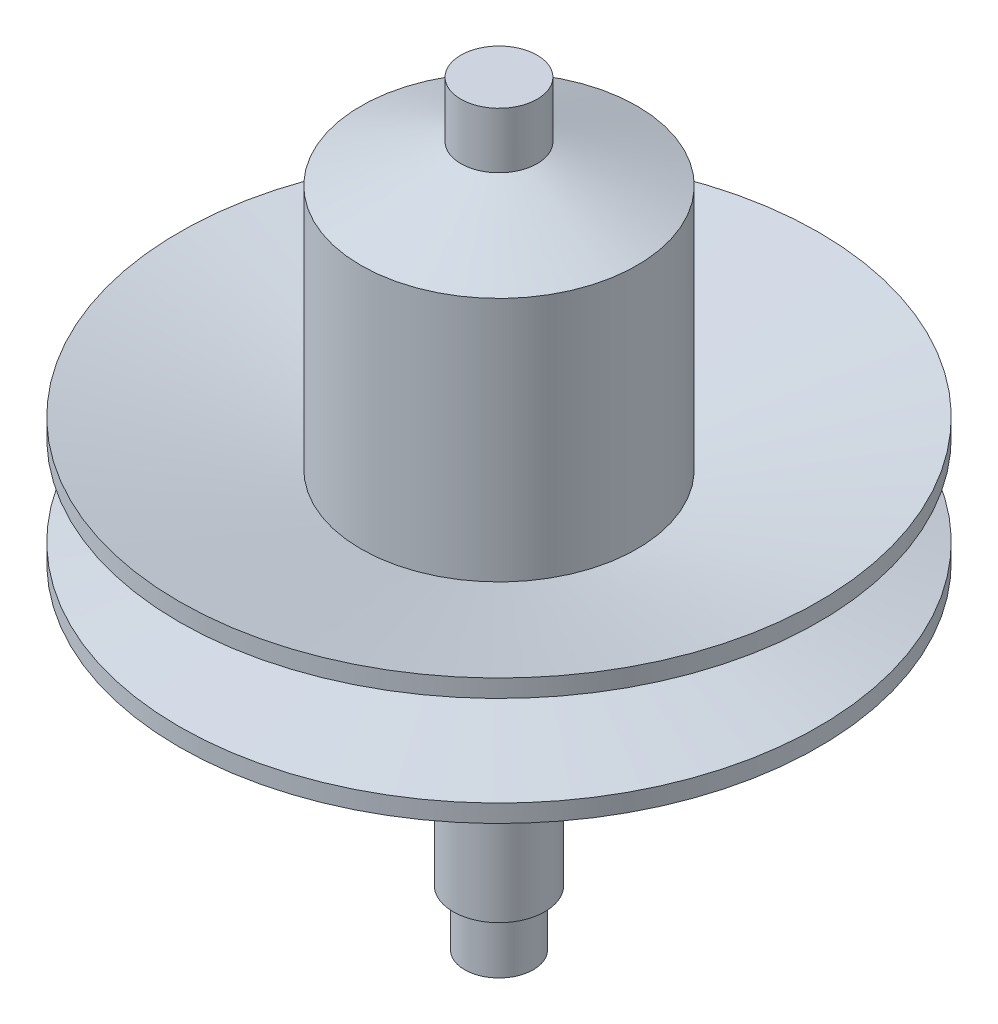
ISO-10303-21;
HEADER;
FILE_DESCRIPTION(('STEP AP214'),'2;1');
FILE_NAME('part.step','',(''),(''),'','','');
FILE_SCHEMA(('AUTOMOTIVE_DESIGN { 1 0 10303 214 1 1 1 1 }'));
ENDSEC;
DATA;
#1=APPLICATION_CONTEXT('core data for automotive mechanical design processes');
#2=APPLICATION_PROTOCOL_DEFINITION('international standard','automotive_design',2000,#1);
#3=PRODUCT_CONTEXT('',#1,'mechanical');
#4=PRODUCT('Part','Part','',(#3));
#5=PRODUCT_RELATED_PRODUCT_CATEGORY('part','',(#4));
#6=PRODUCT_DEFINITION_FORMATION('','',#4);
#7=PRODUCT_DEFINITION_CONTEXT('part definition',#1,'design');
#8=PRODUCT_DEFINITION('design','',#6,#7);
#9=PRODUCT_DEFINITION_SHAPE('','',#8);
#10=(LENGTH_UNIT() NAMED_UNIT(*) SI_UNIT(.MILLI.,.METRE.));
#11=(NAMED_UNIT(*) PLANE_ANGLE_UNIT() SI_UNIT($,.RADIAN.));
#12=(NAMED_UNIT(*) SI_UNIT($,.STERADIAN.) SOLID_ANGLE_UNIT());
#13=UNCERTAINTY_MEASURE_WITH_UNIT(LENGTH_MEASURE(1.E-05),#10,'distance_accuracy_value','');
#14=(GEOMETRIC_REPRESENTATION_CONTEXT(3) GLOBAL_UNCERTAINTY_ASSIGNED_CONTEXT((#13)) GLOBAL_UNIT_ASSIGNED_CONTEXT((#10,
#11,#12)) REPRESENTATION_CONTEXT('',''));
#15=CARTESIAN_POINT('',(0.,0.,0.));
#16=DIRECTION('',(0.,0.,1.));
#17=DIRECTION('',(1.,0.,0.));
#18=AXIS2_PLACEMENT_3D('',#15,#16,#17);
#19=CARTESIAN_POINT('',(4.5,0.,0.));
#20=DIRECTION('',(0.,1.,0.));
#21=DIRECTION('',(0.,0.,1.));
#22=AXIS2_PLACEMENT_3D('',#19,#20,#21);
#23=PLANE('',#22);
#24=CARTESIAN_POINT('',(0.,0.,0.));
#25=DIRECTION('',(0.,1.,0.));
#26=DIRECTION('',(0.,0.,1.));
#27=AXIS2_PLACEMENT_3D('',#24,#25,#26);
#28=CIRCLE('',#27,4.5);
#29=CARTESIAN_POINT('',(0.,0.,4.5));
#30=VERTEX_POINT('',#29);
#31=EDGE_CURVE('E10',#30,#30,#28,.T.);
#32=ORIENTED_EDGE('',*,*,#31,.F.);
#33=EDGE_LOOP('',(#32));
#34=FACE_BOUND('',#33,.T.);
#35=ADVANCED_FACE('F34',(#34),#23,.F.);
#36=CARTESIAN_POINT('',(0.,99.06,0.));
#37=DIRECTION('',(0.,1.,0.));
#38=DIRECTION('',(0.,0.,1.));
#39=AXIS2_PLACEMENT_3D('',#36,#37,#38);
#40=CYLINDRICAL_SURFACE('',#39,4.5);
#41=CARTESIAN_POINT('',(0.,7.33580000000002,0.));
#42=DIRECTION('',(0.,1.,0.));
#43=DIRECTION('',(0.,0.,1.));
#44=AXIS2_PLACEMENT_3D('',#41,#42,#43);
#45=CIRCLE('',#44,4.5);
#46=CARTESIAN_POINT('',(0.,7.33580000000002,4.5));
#47=VERTEX_POINT('',#46);
#48=EDGE_CURVE('E41',#47,#47,#45,.T.);
#49=ORIENTED_EDGE('',*,*,#48,.F.);
#50=EDGE_LOOP('',(#49));
#51=FACE_BOUND('',#50,.T.);
#52=ORIENTED_EDGE('',*,*,#31,.T.);
#53=EDGE_LOOP('',(#52));
#54=FACE_BOUND('',#53,.T.);
#55=ADVANCED_FACE('F168',(#51,#54),#40,.T.);
#56=CARTESIAN_POINT('',(6.00000000000003,7.33580000000002,0.));
#57=DIRECTION('',(0.,1.,0.));
#58=DIRECTION('',(0.,0.,1.));
#59=AXIS2_PLACEMENT_3D('',#56,#57,#58);
#60=PLANE('',#59);
#61=CARTESIAN_POINT('',(0.,7.33580000000002,0.));
#62=DIRECTION('',(0.,1.,0.));
#63=DIRECTION('',(0.,0.,1.));
#64=AXIS2_PLACEMENT_3D('',#61,#62,#63);
#65=CIRCLE('',#64,6.00000000000003);
#66=CARTESIAN_POINT('',(0.,7.33580000000002,6.00000000000003));
#67=VERTEX_POINT('',#66);
#68=EDGE_CURVE('E46',#67,#67,#65,.T.);
#69=ORIENTED_EDGE('',*,*,#68,.F.);
#70=EDGE_LOOP('',(#69));
#71=FACE_BOUND('',#70,.T.);
#72=ORIENTED_EDGE('',*,*,#48,.T.);
#73=EDGE_LOOP('',(#72));
#74=FACE_BOUND('',#73,.T.);
#75=ADVANCED_FACE('F163',(#71,#74),#60,.F.);
#76=CARTESIAN_POINT('',(0.,99.06,0.));
#77=DIRECTION('',(0.,1.,0.));
#78=DIRECTION('',(0.,0.,1.));
#79=AXIS2_PLACEMENT_3D('',#76,#77,#78);
#80=CYLINDRICAL_SURFACE('',#79,6.00000000000003);
#81=CARTESIAN_POINT('',(0.,49.9241417636139,0.));
#82=DIRECTION('',(0.,1.,0.));
#83=DIRECTION('',(0.,0.,1.));
#84=AXIS2_PLACEMENT_3D('',#81,#82,#83);
#85=CIRCLE('',#84,6.00000000000003);
#86=CARTESIAN_POINT('',(0.,49.9241417636139,6.00000000000003));
#87=VERTEX_POINT('',#86);
#88=EDGE_CURVE('E51',#87,#87,#85,.T.);
#89=ORIENTED_EDGE('',*,*,#88,.F.);
#90=EDGE_LOOP('',(#89));
#91=FACE_BOUND('',#90,.T.);
#92=ORIENTED_EDGE('',*,*,#68,.T.);
#93=EDGE_LOOP('',(#92));
#94=FACE_BOUND('',#93,.T.);
#95=ADVANCED_FACE('F157',(#91,#94),#80,.T.);
#96=CARTESIAN_POINT('',(6.00000000000003,49.9241417636139,0.));
#97=DIRECTION('',(0.,1.,0.));
#98=DIRECTION('',(0.,0.,1.));
#99=AXIS2_PLACEMENT_3D('',#96,#97,#98);
#100=PLANE('',#99);
#101=CARTESIAN_POINT('',(0.,49.9241417636139,0.));
#102=DIRECTION('',(0.,1.,0.));
#103=DIRECTION('',(0.,0.,1.));
#104=AXIS2_PLACEMENT_3D('',#101,#102,#103);
#105=CIRCLE('',#104,18.0975);
#106=CARTESIAN_POINT('',(0.,49.9241417636139,18.0975));
#107=VERTEX_POINT('',#106);
#108=EDGE_CURVE('E57',#107,#107,#105,.T.);
#109=ORIENTED_EDGE('',*,*,#108,.F.);
#110=EDGE_LOOP('',(#109));
#111=FACE_BOUND('',#110,.T.);
#112=ORIENTED_EDGE('',*,*,#88,.T.);
#113=EDGE_LOOP('',(#112));
#114=FACE_BOUND('',#113,.T.);
#115=ADVANCED_FACE('F151',(#111,#114),#100,.F.);
#116=CARTESIAN_POINT('',(0.,49.9241417636139,0.));
#117=DIRECTION('',(0.,-1.,0.));
#118=DIRECTION('',(0.,0.,-1.));
#119=AXIS2_PLACEMENT_3D('',#116,#117,#118);
#120=CONICAL_SURFACE('',#119,18.0975,1.32648902966889);
#121=CARTESIAN_POINT('',(0.,43.988,0.));
#122=DIRECTION('',(0.,1.,0.));
#123=DIRECTION('',(0.,0.,1.));
#124=AXIS2_PLACEMENT_3D('',#121,#122,#123);
#125=CIRCLE('',#124,41.91);
#126=CARTESIAN_POINT('',(0.,43.988,41.91));
#127=VERTEX_POINT('',#126);
#128=EDGE_CURVE('E61',#127,#127,#125,.T.);
#129=ORIENTED_EDGE('',*,*,#128,.F.);
#130=EDGE_LOOP('',(#129));
#131=FACE_BOUND('',#130,.T.);
#132=ORIENTED_EDGE('',*,*,#108,.T.);
#133=EDGE_LOOP('',(#132));
#134=FACE_BOUND('',#133,.T.);
#135=ADVANCED_FACE('F145',(#131,#134),#120,.F.);
#136=CARTESIAN_POINT('',(0.,99.06,0.));
#137=DIRECTION('',(0.,1.,0.));
#138=DIRECTION('',(0.,0.,1.));
#139=AXIS2_PLACEMENT_3D('',#136,#137,#138);
#140=CYLINDRICAL_SURFACE('',#139,41.91);
#141=CARTESIAN_POINT('',(0.,46.3068582363862,0.));
#142=DIRECTION('',(0.,1.,0.));
#143=DIRECTION('',(0.,0.,1.));
#144=AXIS2_PLACEMENT_3D('',#141,#142,#143);
#145=CIRCLE('',#144,41.91);
#146=CARTESIAN_POINT('',(0.,46.3068582363862,41.91));
#147=VERTEX_POINT('',#146);
#148=EDGE_CURVE('E65',#147,#147,#145,.T.);
#149=ORIENTED_EDGE('',*,*,#148,.F.);
#150=EDGE_LOOP('',(#149));
#151=FACE_BOUND('',#150,.T.);
#152=ORIENTED_EDGE('',*,*,#128,.T.);
#153=EDGE_LOOP('',(#152));
#154=FACE_BOUND('',#153,.T.);
#155=ADVANCED_FACE('F139',(#151,#154),#140,.T.);
#156=CARTESIAN_POINT('',(0.,46.3068582363862,0.));
#157=DIRECTION('',(0.,-1.,0.));
#158=DIRECTION('',(0.,0.,-1.));
#159=AXIS2_PLACEMENT_3D('',#156,#157,#158);
#160=CONICAL_SURFACE('',#159,41.91,1.32648902966889);
#161=CARTESIAN_POINT('',(0.,52.243,0.));
#162=DIRECTION('',(0.,1.,0.));
#163=DIRECTION('',(0.,0.,1.));
#164=AXIS2_PLACEMENT_3D('',#161,#162,#163);
#165=CIRCLE('',#164,18.0975);
#166=CARTESIAN_POINT('',(0.,52.243,18.0975));
#167=VERTEX_POINT('',#166);
#168=EDGE_CURVE('E69',#167,#167,#165,.T.);
#169=ORIENTED_EDGE('',*,*,#168,.F.);
#170=EDGE_LOOP('',(#169));
#171=FACE_BOUND('',#170,.T.);
#172=ORIENTED_EDGE('',*,*,#148,.T.);
#173=EDGE_LOOP('',(#172));
#174=FACE_BOUND('',#173,.T.);
#175=ADVANCED_FACE('F133',(#171,#174),#160,.T.);
#176=CARTESIAN_POINT('',(0.,52.243,0.));
#177=DIRECTION('',(0.,1.,0.));
#178=DIRECTION('',(0.,0.,1.));
#179=AXIS2_PLACEMENT_3D('',#176,#177,#178);
#180=CONICAL_SURFACE('',#179,18.0975,1.32648902966889);
#181=CARTESIAN_POINT('',(0.,58.1791417636139,0.));
#182=DIRECTION('',(0.,1.,0.));
#183=DIRECTION('',(0.,0.,1.));
#184=AXIS2_PLACEMENT_3D('',#181,#182,#183);
#185=CIRCLE('',#184,41.91);
#186=CARTESIAN_POINT('',(0.,58.1791417636139,41.91));
#187=VERTEX_POINT('',#186);
#188=EDGE_CURVE('E73',#187,#187,#185,.T.);
#189=ORIENTED_EDGE('',*,*,#188,.F.);
#190=EDGE_LOOP('',(#189));
#191=FACE_BOUND('',#190,.T.);
#192=ORIENTED_EDGE('',*,*,#168,.T.);
#193=EDGE_LOOP('',(#192));
#194=FACE_BOUND('',#193,.T.);
#195=ADVANCED_FACE('F127',(#191,#194),#180,.T.);
#196=CARTESIAN_POINT('',(0.,99.06,0.));
#197=DIRECTION('',(0.,1.,0.));
#198=DIRECTION('',(0.,0.,1.));
#199=AXIS2_PLACEMENT_3D('',#196,#197,#198);
#200=CYLINDRICAL_SURFACE('',#199,41.91);
#201=CARTESIAN_POINT('',(0.,60.498,0.));
#202=DIRECTION('',(0.,1.,0.));
#203=DIRECTION('',(0.,0.,1.));
#204=AXIS2_PLACEMENT_3D('',#201,#202,#203);
#205=CIRCLE('',#204,41.91);
#206=CARTESIAN_POINT('',(0.,60.498,41.91));
#207=VERTEX_POINT('',#206);
#208=EDGE_CURVE('E77',#207,#207,#205,.T.);
#209=ORIENTED_EDGE('',*,*,#208,.F.);
#210=EDGE_LOOP('',(#209));
#211=FACE_BOUND('',#210,.T.);
#212=ORIENTED_EDGE('',*,*,#188,.T.);
#213=EDGE_LOOP('',(#212));
#214=FACE_BOUND('',#213,.T.);
#215=ADVANCED_FACE('F121',(#211,#214),#200,.T.);
#216=CARTESIAN_POINT('',(0.,60.498,0.));
#217=DIRECTION('',(0.,1.,0.));
#218=DIRECTION('',(0.,0.,1.));
#219=AXIS2_PLACEMENT_3D('',#216,#217,#218);
#220=CONICAL_SURFACE('',#219,41.91,1.32648902966889);
#221=CARTESIAN_POINT('',(0.,54.5618582363862,0.));
#222=DIRECTION('',(0.,1.,0.));
#223=DIRECTION('',(0.,0.,1.));
#224=AXIS2_PLACEMENT_3D('',#221,#222,#223);
#225=CIRCLE('',#224,18.0975);
#226=CARTESIAN_POINT('',(0.,54.5618582363862,18.0975));
#227=VERTEX_POINT('',#226);
#228=EDGE_CURVE('E81',#227,#227,#225,.T.);
#229=ORIENTED_EDGE('',*,*,#228,.F.);
#230=EDGE_LOOP('',(#229));
#231=FACE_BOUND('',#230,.T.);
#232=ORIENTED_EDGE('',*,*,#208,.T.);
#233=EDGE_LOOP('',(#232));
#234=FACE_BOUND('',#233,.T.);
#235=ADVANCED_FACE('F115',(#231,#234),#220,.F.);
#236=CARTESIAN_POINT('',(0.,99.06,0.));
#237=DIRECTION('',(0.,1.,0.));
#238=DIRECTION('',(0.,0.,1.));
#239=AXIS2_PLACEMENT_3D('',#236,#237,#238);
#240=CYLINDRICAL_SURFACE('',#239,18.0975);
#241=CARTESIAN_POINT('',(0.,86.74,0.));
#242=DIRECTION('',(0.,1.,0.));
#243=DIRECTION('',(0.,0.,1.));
#244=AXIS2_PLACEMENT_3D('',#241,#242,#243);
#245=CIRCLE('',#244,18.0975);
#246=CARTESIAN_POINT('',(0.,86.74,-18.0975));
#247=VERTEX_POINT('',#246);
#248=EDGE_CURVE('E85',#247,#247,#245,.T.);
#249=ORIENTED_EDGE('',*,*,#248,.F.);
#250=EDGE_LOOP('',(#249));
#251=FACE_BOUND('',#250,.T.);
#252=ORIENTED_EDGE('',*,*,#228,.T.);
#253=EDGE_LOOP('',(#252));
#254=FACE_BOUND('',#253,.T.);
#255=ADVANCED_FACE('F109',(#251,#254),#240,.T.);
#256=CARTESIAN_POINT('',(0.,86.74,0.));
#257=DIRECTION('',(0.,-1.,0.));
#258=DIRECTION('',(0.,0.,-1.));
#259=AXIS2_PLACEMENT_3D('',#256,#257,#258);
#260=CONICAL_SURFACE('',#259,18.0975,1.20611906300067);
#261=CARTESIAN_POINT('',(0.,91.74,0.));
#262=DIRECTION('',(0.,1.,0.));
#263=DIRECTION('',(0.,0.,1.));
#264=AXIS2_PLACEMENT_3D('',#261,#262,#263);
#265=CIRCLE('',#264,5.);
#266=CARTESIAN_POINT('',(0.,91.74,-5.00000000000002));
#267=VERTEX_POINT('',#266);
#268=EDGE_CURVE('E89',#267,#267,#265,.T.);
#269=CARTESIAN_POINT('',(0.,91.74,-5.00000000000002));
#270=CARTESIAN_POINT('',(0.,91.6879166666667,-5.13643229166668));
#271=CARTESIAN_POINT('',(0.,91.6358333333333,-5.27286458333335));
#272=CARTESIAN_POINT('',(0.,91.5316666666667,-5.54572916666669));
#273=CARTESIAN_POINT('',(0.,91.4795833333333,-5.68216145833335));
#274=CARTESIAN_POINT('',(0.,91.3754166666667,-5.95502604166669));
#275=CARTESIAN_POINT('',(0.,91.3233333333334,-6.09145833333335));
#276=CARTESIAN_POINT('',(0.,91.2191666666667,-6.36432291666669));
#277=CARTESIAN_POINT('',(0.,91.1670833333333,-6.50075520833335));
#278=CARTESIAN_POINT('',(0.,91.0629166666667,-6.77361979166668));
#279=CARTESIAN_POINT('',(0.,91.0108333333333,-6.91005208333335));
#280=CARTESIAN_POINT('',(0.,90.9066666666667,-7.18291666666669));
#281=CARTESIAN_POINT('',(0.,90.8545833333333,-7.31934895833335));
#282=CARTESIAN_POINT('',(0.,90.7504166666667,-7.59221354166668));
#283=CARTESIAN_POINT('',(0.,90.6983333333333,-7.72864583333335));
#284=CARTESIAN_POINT('',(0.,90.5941666666667,-8.00151041666668));
#285=CARTESIAN_POINT('',(0.,90.5420833333334,-8.13794270833335));
#286=CARTESIAN_POINT('',(0.,90.4379166666667,-8.41080729166669));
#287=CARTESIAN_POINT('',(0.,90.3858333333334,-8.54723958333335));
#288=CARTESIAN_POINT('',(0.,90.2816666666667,-8.82010416666668));
#289=CARTESIAN_POINT('',(0.,90.2295833333333,-8.95653645833335));
#290=CARTESIAN_POINT('',(0.,90.1254166666667,-9.22940104166669));
#291=CARTESIAN_POINT('',(0.,90.0733333333334,-9.36583333333335));
#292=CARTESIAN_POINT('',(0.,89.9691666666667,-9.63869791666668));
#293=CARTESIAN_POINT('',(0.,89.9170833333333,-9.77513020833335));
#294=CARTESIAN_POINT('',(0.,89.8129166666667,-10.0479947916667));
#295=CARTESIAN_POINT('',(0.,89.7608333333333,-10.1844270833334));
#296=CARTESIAN_POINT('',(0.,89.6566666666667,-10.4572916666667));
#297=CARTESIAN_POINT('',(0.,89.6045833333333,-10.5937239583334));
#298=CARTESIAN_POINT('',(0.,89.5004166666667,-10.8665885416667));
#299=CARTESIAN_POINT('',(0.,89.4483333333333,-11.0030208333334));
#300=CARTESIAN_POINT('',(0.,89.3441666666667,-11.2758854166667));
#301=CARTESIAN_POINT('',(0.,89.2920833333334,-11.4123177083334));
#302=CARTESIAN_POINT('',(0.,89.1879166666667,-11.6851822916667));
#303=CARTESIAN_POINT('',(0.,89.1358333333333,-11.8216145833333));
#304=CARTESIAN_POINT('',(0.,89.0316666666667,-12.0944791666667));
#305=CARTESIAN_POINT('',(0.,88.9795833333333,-12.2309114583334));
#306=CARTESIAN_POINT('',(0.,88.8754166666667,-12.5037760416667));
#307=CARTESIAN_POINT('',(0.,88.8233333333334,-12.6402083333334));
#308=CARTESIAN_POINT('',(0.,88.7191666666667,-12.9130729166667));
#309=CARTESIAN_POINT('',(0.,88.6670833333333,-13.0495052083334));
#310=CARTESIAN_POINT('',(0.,88.5629166666667,-13.3223697916667));
#311=CARTESIAN_POINT('',(0.,88.5108333333333,-13.4588020833334));
#312=CARTESIAN_POINT('',(0.,88.4066666666667,-13.7316666666667));
#313=CARTESIAN_POINT('',(0.,88.3545833333333,-13.8680989583334));
#314=CARTESIAN_POINT('',(0.,88.2504166666667,-14.1409635416667));
#315=CARTESIAN_POINT('',(0.,88.1983333333333,-14.2773958333334));
#316=CARTESIAN_POINT('',(0.,88.0941666666667,-14.5502604166667));
#317=CARTESIAN_POINT('',(0.,88.0420833333334,-14.6866927083334));
#318=CARTESIAN_POINT('',(0.,87.9379166666667,-14.9595572916667));
#319=CARTESIAN_POINT('',(0.,87.8858333333333,-15.0959895833334));
#320=CARTESIAN_POINT('',(0.,87.7816666666667,-15.3688541666667));
#321=CARTESIAN_POINT('',(0.,87.7295833333333,-15.5052864583334));
#322=CARTESIAN_POINT('',(0.,87.6254166666667,-15.7781510416667));
#323=CARTESIAN_POINT('',(0.,87.5733333333334,-15.9145833333334));
#324=CARTESIAN_POINT('',(0.,87.4691666666667,-16.1874479166667));
#325=CARTESIAN_POINT('',(0.,87.4170833333333,-16.3238802083333));
#326=CARTESIAN_POINT('',(0.,87.3129166666667,-16.5967447916667));
#327=CARTESIAN_POINT('',(0.,87.2608333333333,-16.7331770833334));
#328=CARTESIAN_POINT('',(0.,87.1566666666667,-17.0060416666667));
#329=CARTESIAN_POINT('',(0.,87.1045833333333,-17.1424739583334));
#330=CARTESIAN_POINT('',(0.,87.0004166666667,-17.4153385416667));
#331=CARTESIAN_POINT('',(0.,86.9483333333333,-17.5517708333334));
#332=CARTESIAN_POINT('',(0.,86.8441666666667,-17.8246354166667));
#333=CARTESIAN_POINT('',(0.,86.7920833333333,-17.9610677083334));
#334=CARTESIAN_POINT('',(0.,86.74,-18.0975));
#335=B_SPLINE_CURVE_WITH_KNOTS('',3,(#269,#270,#271,#272,#273,#274,#275,#276,#277,#278,#279,
#280,#281,#282,#283,#284,#285,#286,#287,#288,#289,#290,#291,#292,#293,#294,#295,#296,#297,#298,
#299,#300,#301,#302,#303,#304,#305,#306,#307,#308,#309,#310,#311,#312,#313,#314,#315,#316,#317,
#318,#319,#320,#321,#322,#323,#324,#325,#326,#327,#328,#329,#330,#331,#332,#333,#334),
.UNSPECIFIED.,.F.,.F.,(4,2,2,2,2,2,2,2,2,2,2,2,2,2,2,2,2,2,2,2,2,2,2,2,2,2,2,2,2,2,2,2,4),(0.,
0.438107286386303,0.876214572772599,1.3143218591589,1.7524291455452,2.19053643193149,
2.62864371831779,3.06675100470409,3.50485829109038,3.94296557747669,4.38107286386298,
4.81918015024928,5.25728743663558,5.69539472302188,6.13350200940817,6.57160929579447,
7.00971658218076,7.44782386856707,7.88593115495336,8.32403844133966,8.76214572772596,
9.20025301411226,9.63836030049856,10.0764675868849,10.5145748732712,10.9526821596575,
11.3907894460438,11.82889673243,12.2670040188164,12.7051113052026,13.1432185915889,
13.5813258779752,14.0194331643615),.UNSPECIFIED.);
#336=EDGE_CURVE('BSEAM103',#267,#247,#335,.T.);
#337=ORIENTED_EDGE('',*,*,#268,.F.);
#338=ORIENTED_EDGE('',*,*,#248,.T.);
#339=ORIENTED_EDGE('',*,*,#336,.T.);
#340=ORIENTED_EDGE('',*,*,#336,.F.);
#341=EDGE_LOOP('',(#337,#339,#338,#340));
#342=FACE_BOUND('',#341,.T.);
#343=ADVANCED_FACE('F103',(#342),#260,.T.);
#344=CARTESIAN_POINT('',(0.,99.06,0.));
#345=DIRECTION('',(0.,1.,0.));
#346=DIRECTION('',(0.,0.,1.));
#347=AXIS2_PLACEMENT_3D('',#344,#345,#346);
#348=CYLINDRICAL_SURFACE('',#347,5.);
#349=CARTESIAN_POINT('',(0.,99.06,0.));
#350=DIRECTION('',(0.,1.,0.));
#351=DIRECTION('',(0.,0.,1.));
#352=AXIS2_PLACEMENT_3D('',#349,#350,#351);
#353=CIRCLE('',#352,5.);
#354=CARTESIAN_POINT('',(0.,99.06,5.));
#355=VERTEX_POINT('',#354);
#356=EDGE_CURVE('E93',#355,#355,#353,.T.);
#357=ORIENTED_EDGE('',*,*,#356,.F.);
#358=EDGE_LOOP('',(#357));
#359=FACE_BOUND('',#358,.T.);
#360=ORIENTED_EDGE('',*,*,#268,.T.);
#361=EDGE_LOOP('',(#360));
#362=FACE_BOUND('',#361,.T.);
#363=ADVANCED_FACE('F100',(#359,#362),#348,.T.);
#364=CARTESIAN_POINT('',(0.,99.06,0.));
#365=DIRECTION('',(0.,-1.,0.));
#366=DIRECTION('',(0.,0.,-1.));
#367=AXIS2_PLACEMENT_3D('',#364,#365,#366);
#368=PLANE('',#367);
#369=ORIENTED_EDGE('',*,*,#356,.T.);
#370=EDGE_LOOP('',(#369));
#371=FACE_BOUND('',#370,.T.);
#372=ADVANCED_FACE('F98',(#371),#368,.F.);
#373=CLOSED_SHELL('',(#35,#55,#75,#95,#115,#135,#155,#175,#195,#215,#235,#255,#343,#363,#372));
#374=MANIFOLD_SOLID_BREP('B2',#373);
#375=ADVANCED_BREP_SHAPE_REPRESENTATION('',(#18,#374),#14);
#376=SHAPE_DEFINITION_REPRESENTATION(#9,#375);
ENDSEC;
END-ISO-10303-21;
